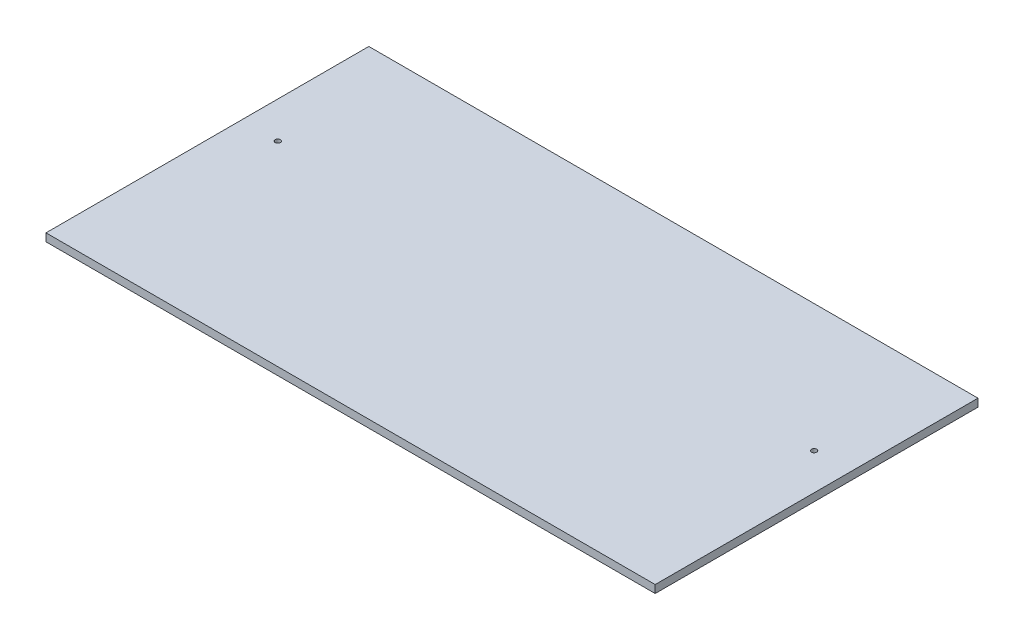
ISO-10303-21;
HEADER;
FILE_DESCRIPTION(('STEP AP214'),'2;1');
FILE_NAME('part.step','',(''),(''),'','','');
FILE_SCHEMA(('AUTOMOTIVE_DESIGN { 1 0 10303 214 1 1 1 1 }'));
ENDSEC;
DATA;
#1=APPLICATION_CONTEXT('core data for automotive mechanical design processes');
#2=APPLICATION_PROTOCOL_DEFINITION('international standard','automotive_design',2000,#1);
#3=PRODUCT_CONTEXT('',#1,'mechanical');
#4=PRODUCT('Part','Part','',(#3));
#5=PRODUCT_RELATED_PRODUCT_CATEGORY('part','',(#4));
#6=PRODUCT_DEFINITION_FORMATION('','',#4);
#7=PRODUCT_DEFINITION_CONTEXT('part definition',#1,'design');
#8=PRODUCT_DEFINITION('design','',#6,#7);
#9=PRODUCT_DEFINITION_SHAPE('','',#8);
#10=(LENGTH_UNIT() NAMED_UNIT(*) SI_UNIT(.MILLI.,.METRE.));
#11=(NAMED_UNIT(*) PLANE_ANGLE_UNIT() SI_UNIT($,.RADIAN.));
#12=(NAMED_UNIT(*) SI_UNIT($,.STERADIAN.) SOLID_ANGLE_UNIT());
#13=UNCERTAINTY_MEASURE_WITH_UNIT(LENGTH_MEASURE(1.E-05),#10,'distance_accuracy_value','');
#14=(GEOMETRIC_REPRESENTATION_CONTEXT(3) GLOBAL_UNCERTAINTY_ASSIGNED_CONTEXT((#13)) GLOBAL_UNIT_ASSIGNED_CONTEXT((#10,
#11,#12)) REPRESENTATION_CONTEXT('',''));
#15=CARTESIAN_POINT('',(0.,0.,0.));
#16=DIRECTION('',(0.,0.,1.));
#17=DIRECTION('',(1.,0.,0.));
#18=AXIS2_PLACEMENT_3D('',#15,#16,#17);
#19=CARTESIAN_POINT('',(371.475,9.525,196.85));
#20=DIRECTION('',(-1.,0.,0.));
#21=DIRECTION('',(0.,0.,1.));
#22=AXIS2_PLACEMENT_3D('',#19,#20,#21);
#23=PLANE('',#22);
#24=DIRECTION('',(0.,0.,-1.));
#25=VECTOR('',#24,1.);
#26=CARTESIAN_POINT('',(371.475,0.,196.85));
#27=LINE('',#26,#25);
#28=CARTESIAN_POINT('',(371.475,0.,196.85));
#29=VERTEX_POINT('',#28);
#30=CARTESIAN_POINT('',(371.475,0.,-196.85));
#31=VERTEX_POINT('',#30);
#32=EDGE_CURVE('E101',#29,#31,#27,.T.);
#33=ORIENTED_EDGE('',*,*,#32,.T.);
#34=DIRECTION('',(0.,-1.,0.));
#35=VECTOR('',#34,1.);
#36=CARTESIAN_POINT('',(371.475,9.525,-196.85));
#37=LINE('',#36,#35);
#38=CARTESIAN_POINT('',(371.475,9.525,-196.85));
#39=VERTEX_POINT('',#38);
#40=EDGE_CURVE('E11',#39,#31,#37,.T.);
#41=ORIENTED_EDGE('',*,*,#40,.F.);
#42=DIRECTION('',(0.,0.,-1.));
#43=VECTOR('',#42,1.);
#44=CARTESIAN_POINT('',(371.475,9.525,196.85));
#45=LINE('',#44,#43);
#46=CARTESIAN_POINT('',(371.475,9.525,196.85));
#47=VERTEX_POINT('',#46);
#48=EDGE_CURVE('E89',#47,#39,#45,.T.);
#49=ORIENTED_EDGE('',*,*,#48,.F.);
#50=DIRECTION('',(0.,-1.,0.));
#51=VECTOR('',#50,1.);
#52=CARTESIAN_POINT('',(371.475,9.525,196.85));
#53=LINE('',#52,#51);
#54=EDGE_CURVE('E97',#47,#29,#53,.T.);
#55=ORIENTED_EDGE('',*,*,#54,.T.);
#56=EDGE_LOOP('',(#33,#41,#49,#55));
#57=FACE_BOUND('',#56,.T.);
#58=ADVANCED_FACE('F38',(#57),#23,.F.);
#59=CARTESIAN_POINT('',(-371.475,9.525,-196.85));
#60=DIRECTION('',(0.,0.,1.));
#61=DIRECTION('',(1.,0.,0.));
#62=AXIS2_PLACEMENT_3D('',#59,#60,#61);
#63=PLANE('',#62);
#64=DIRECTION('',(-1.,0.,0.));
#65=VECTOR('',#64,1.);
#66=CARTESIAN_POINT('',(-371.475,0.,-196.85));
#67=LINE('',#66,#65);
#68=CARTESIAN_POINT('',(-371.475,0.,-196.85));
#69=VERTEX_POINT('',#68);
#70=EDGE_CURVE('E93',#31,#69,#67,.T.);
#71=ORIENTED_EDGE('',*,*,#70,.T.);
#72=DIRECTION('',(0.,-1.,0.));
#73=VECTOR('',#72,1.);
#74=CARTESIAN_POINT('',(-371.475,9.525,-196.85));
#75=LINE('',#74,#73);
#76=CARTESIAN_POINT('',(-371.475,9.525,-196.85));
#77=VERTEX_POINT('',#76);
#78=EDGE_CURVE('E46',#77,#69,#75,.T.);
#79=ORIENTED_EDGE('',*,*,#78,.F.);
#80=DIRECTION('',(-1.,0.,0.));
#81=VECTOR('',#80,1.);
#82=CARTESIAN_POINT('',(-371.475,9.525,-196.85));
#83=LINE('',#82,#81);
#84=EDGE_CURVE('E84',#39,#77,#83,.T.);
#85=ORIENTED_EDGE('',*,*,#84,.F.);
#86=ORIENTED_EDGE('',*,*,#40,.T.);
#87=EDGE_LOOP('',(#71,#79,#85,#86));
#88=FACE_BOUND('',#87,.T.);
#89=ADVANCED_FACE('F92',(#88),#63,.F.);
#90=CARTESIAN_POINT('',(-371.475,9.525,196.85));
#91=DIRECTION('',(1.,0.,0.));
#92=DIRECTION('',(0.,0.,-1.));
#93=AXIS2_PLACEMENT_3D('',#90,#91,#92);
#94=PLANE('',#93);
#95=DIRECTION('',(0.,0.,1.));
#96=VECTOR('',#95,1.);
#97=CARTESIAN_POINT('',(-371.475,0.,196.85));
#98=LINE('',#97,#96);
#99=CARTESIAN_POINT('',(-371.475,0.,196.85));
#100=VERTEX_POINT('',#99);
#101=EDGE_CURVE('E71',#69,#100,#98,.T.);
#102=ORIENTED_EDGE('',*,*,#101,.T.);
#103=DIRECTION('',(0.,-1.,0.));
#104=VECTOR('',#103,1.);
#105=CARTESIAN_POINT('',(-371.475,9.525,196.85));
#106=LINE('',#105,#104);
#107=CARTESIAN_POINT('',(-371.475,9.525,196.85));
#108=VERTEX_POINT('',#107);
#109=EDGE_CURVE('E94',#108,#100,#106,.T.);
#110=ORIENTED_EDGE('',*,*,#109,.F.);
#111=DIRECTION('',(0.,0.,1.));
#112=VECTOR('',#111,1.);
#113=CARTESIAN_POINT('',(-371.475,9.525,196.85));
#114=LINE('',#113,#112);
#115=EDGE_CURVE('E87',#77,#108,#114,.T.);
#116=ORIENTED_EDGE('',*,*,#115,.F.);
#117=ORIENTED_EDGE('',*,*,#78,.T.);
#118=EDGE_LOOP('',(#102,#110,#116,#117));
#119=FACE_BOUND('',#118,.T.);
#120=ADVANCED_FACE('F95',(#119),#94,.F.);
#121=CARTESIAN_POINT('',(-371.475,9.525,196.85));
#122=DIRECTION('',(0.,0.,-1.));
#123=DIRECTION('',(-1.,0.,0.));
#124=AXIS2_PLACEMENT_3D('',#121,#122,#123);
#125=PLANE('',#124);
#126=DIRECTION('',(1.,0.,0.));
#127=VECTOR('',#126,1.);
#128=CARTESIAN_POINT('',(-371.475,0.,196.85));
#129=LINE('',#128,#127);
#130=EDGE_CURVE('E77',#100,#29,#129,.T.);
#131=ORIENTED_EDGE('',*,*,#130,.T.);
#132=ORIENTED_EDGE('',*,*,#54,.F.);
#133=DIRECTION('',(1.,0.,0.));
#134=VECTOR('',#133,1.);
#135=CARTESIAN_POINT('',(-371.475,9.525,196.85));
#136=LINE('',#135,#134);
#137=EDGE_CURVE('E54',#108,#47,#136,.T.);
#138=ORIENTED_EDGE('',*,*,#137,.F.);
#139=ORIENTED_EDGE('',*,*,#109,.T.);
#140=EDGE_LOOP('',(#131,#132,#138,#139));
#141=FACE_BOUND('',#140,.T.);
#142=ADVANCED_FACE('F109',(#141),#125,.F.);
#143=CARTESIAN_POINT('',(0.,9.525,0.));
#144=DIRECTION('',(0.,-1.,0.));
#145=DIRECTION('',(0.,0.,-1.));
#146=AXIS2_PLACEMENT_3D('',#143,#144,#145);
#147=PLANE('',#146);
#148=CARTESIAN_POINT('',(-327.025,9.525,-41.402));
#149=DIRECTION('',(0.,1.,0.));
#150=DIRECTION('',(0.,0.,1.));
#151=AXIS2_PLACEMENT_3D('',#148,#149,#150);
#152=CIRCLE('',#151,3.17499999999997);
#153=CARTESIAN_POINT('',(-327.025,9.525,-38.227));
#154=VERTEX_POINT('',#153);
#155=EDGE_CURVE('E121',#154,#154,#152,.T.);
#156=ORIENTED_EDGE('',*,*,#155,.F.);
#157=EDGE_LOOP('',(#156));
#158=FACE_BOUND('',#157,.T.);
#159=CARTESIAN_POINT('',(327.025,9.525,-41.402));
#160=DIRECTION('',(0.,1.,0.));
#161=DIRECTION('',(0.,0.,1.));
#162=AXIS2_PLACEMENT_3D('',#159,#160,#161);
#163=CIRCLE('',#162,3.17499999999997);
#164=CARTESIAN_POINT('',(327.025,9.525,-38.227));
#165=VERTEX_POINT('',#164);
#166=EDGE_CURVE('E115',#165,#165,#163,.T.);
#167=ORIENTED_EDGE('',*,*,#166,.F.);
#168=EDGE_LOOP('',(#167));
#169=FACE_BOUND('',#168,.T.);
#170=ORIENTED_EDGE('',*,*,#48,.T.);
#171=ORIENTED_EDGE('',*,*,#84,.T.);
#172=ORIENTED_EDGE('',*,*,#115,.T.);
#173=ORIENTED_EDGE('',*,*,#137,.T.);
#174=EDGE_LOOP('',(#170,#171,#172,#173));
#175=FACE_BOUND('',#174,.T.);
#176=ADVANCED_FACE('F85',(#158,#169,#175),#147,.F.);
#177=CARTESIAN_POINT('',(0.,0.,0.));
#178=DIRECTION('',(0.,-1.,0.));
#179=DIRECTION('',(0.,0.,-1.));
#180=AXIS2_PLACEMENT_3D('',#177,#178,#179);
#181=PLANE('',#180);
#182=CARTESIAN_POINT('',(-327.025,0.,-41.402));
#183=DIRECTION('',(0.,1.,0.));
#184=DIRECTION('',(0.,0.,1.));
#185=AXIS2_PLACEMENT_3D('',#182,#183,#184);
#186=CIRCLE('',#185,3.17499999999997);
#187=CARTESIAN_POINT('',(-327.025,0.,-38.227));
#188=VERTEX_POINT('',#187);
#189=EDGE_CURVE('E104',#188,#188,#186,.T.);
#190=ORIENTED_EDGE('',*,*,#189,.T.);
#191=EDGE_LOOP('',(#190));
#192=FACE_BOUND('',#191,.T.);
#193=CARTESIAN_POINT('',(327.025,0.,-41.402));
#194=DIRECTION('',(0.,1.,0.));
#195=DIRECTION('',(0.,0.,1.));
#196=AXIS2_PLACEMENT_3D('',#193,#194,#195);
#197=CIRCLE('',#196,3.17499999999997);
#198=CARTESIAN_POINT('',(327.025,0.,-38.227));
#199=VERTEX_POINT('',#198);
#200=EDGE_CURVE('E118',#199,#199,#197,.T.);
#201=ORIENTED_EDGE('',*,*,#200,.T.);
#202=EDGE_LOOP('',(#201));
#203=FACE_BOUND('',#202,.T.);
#204=ORIENTED_EDGE('',*,*,#32,.F.);
#205=ORIENTED_EDGE('',*,*,#130,.F.);
#206=ORIENTED_EDGE('',*,*,#101,.F.);
#207=ORIENTED_EDGE('',*,*,#70,.F.);
#208=EDGE_LOOP('',(#204,#205,#206,#207));
#209=FACE_BOUND('',#208,.T.);
#210=ADVANCED_FACE('F112',(#192,#203,#209),#181,.T.);
#211=CARTESIAN_POINT('',(327.025,0.,-41.402));
#212=DIRECTION('',(0.,1.,0.));
#213=DIRECTION('',(0.,0.,1.));
#214=AXIS2_PLACEMENT_3D('',#211,#212,#213);
#215=CYLINDRICAL_SURFACE('',#214,3.17499999999997);
#216=CARTESIAN_POINT('',(327.025,0.,-38.227));
#217=CARTESIAN_POINT('',(327.025,0.0992187499999999,-38.227));
#218=CARTESIAN_POINT('',(327.025,0.1984375,-38.227));
#219=CARTESIAN_POINT('',(327.025,0.396875,-38.227));
#220=CARTESIAN_POINT('',(327.025,0.49609375,-38.227));
#221=CARTESIAN_POINT('',(327.025,0.69453125,-38.227));
#222=CARTESIAN_POINT('',(327.025,0.79375,-38.227));
#223=CARTESIAN_POINT('',(327.025,0.9921875,-38.227));
#224=CARTESIAN_POINT('',(327.025,1.09140625,-38.227));
#225=CARTESIAN_POINT('',(327.025,1.28984375,-38.227));
#226=CARTESIAN_POINT('',(327.025,1.3890625,-38.227));
#227=CARTESIAN_POINT('',(327.025,1.5875,-38.227));
#228=CARTESIAN_POINT('',(327.025,1.68671875,-38.227));
#229=CARTESIAN_POINT('',(327.025,1.88515625,-38.227));
#230=CARTESIAN_POINT('',(327.025,1.984375,-38.227));
#231=CARTESIAN_POINT('',(327.025,2.1828125,-38.227));
#232=CARTESIAN_POINT('',(327.025,2.28203125,-38.227));
#233=CARTESIAN_POINT('',(327.025,2.48046875,-38.227));
#234=CARTESIAN_POINT('',(327.025,2.5796875,-38.227));
#235=CARTESIAN_POINT('',(327.025,2.778125,-38.227));
#236=CARTESIAN_POINT('',(327.025,2.87734375,-38.227));
#237=CARTESIAN_POINT('',(327.025,3.07578125,-38.227));
#238=CARTESIAN_POINT('',(327.025,3.175,-38.227));
#239=CARTESIAN_POINT('',(327.025,3.3734375,-38.227));
#240=CARTESIAN_POINT('',(327.025,3.47265625,-38.227));
#241=CARTESIAN_POINT('',(327.025,3.67109375,-38.227));
#242=CARTESIAN_POINT('',(327.025,3.7703125,-38.227));
#243=CARTESIAN_POINT('',(327.025,3.96875,-38.227));
#244=CARTESIAN_POINT('',(327.025,4.06796875,-38.227));
#245=CARTESIAN_POINT('',(327.025,4.26640625,-38.227));
#246=CARTESIAN_POINT('',(327.025,4.365625,-38.227));
#247=CARTESIAN_POINT('',(327.025,4.5640625,-38.227));
#248=CARTESIAN_POINT('',(327.025,4.66328125,-38.227));
#249=CARTESIAN_POINT('',(327.025,4.86171875,-38.227));
#250=CARTESIAN_POINT('',(327.025,4.9609375,-38.227));
#251=CARTESIAN_POINT('',(327.025,5.159375,-38.227));
#252=CARTESIAN_POINT('',(327.025,5.25859375,-38.227));
#253=CARTESIAN_POINT('',(327.025,5.45703125,-38.227));
#254=CARTESIAN_POINT('',(327.025,5.55625,-38.227));
#255=CARTESIAN_POINT('',(327.025,5.7546875,-38.227));
#256=CARTESIAN_POINT('',(327.025,5.85390625,-38.227));
#257=CARTESIAN_POINT('',(327.025,6.05234375,-38.227));
#258=CARTESIAN_POINT('',(327.025,6.1515625,-38.227));
#259=CARTESIAN_POINT('',(327.025,6.35,-38.227));
#260=CARTESIAN_POINT('',(327.025,6.44921875,-38.227));
#261=CARTESIAN_POINT('',(327.025,6.64765625,-38.227));
#262=CARTESIAN_POINT('',(327.025,6.746875,-38.227));
#263=CARTESIAN_POINT('',(327.025,6.9453125,-38.227));
#264=CARTESIAN_POINT('',(327.025,7.04453125,-38.227));
#265=CARTESIAN_POINT('',(327.025,7.24296875,-38.227));
#266=CARTESIAN_POINT('',(327.025,7.3421875,-38.227));
#267=CARTESIAN_POINT('',(327.025,7.540625,-38.227));
#268=CARTESIAN_POINT('',(327.025,7.63984375,-38.227));
#269=CARTESIAN_POINT('',(327.025,7.83828125,-38.227));
#270=CARTESIAN_POINT('',(327.025,7.9375,-38.227));
#271=CARTESIAN_POINT('',(327.025,8.1359375,-38.227));
#272=CARTESIAN_POINT('',(327.025,8.23515625,-38.227));
#273=CARTESIAN_POINT('',(327.025,8.43359375,-38.227));
#274=CARTESIAN_POINT('',(327.025,8.5328125,-38.227));
#275=CARTESIAN_POINT('',(327.025,8.73125,-38.227));
#276=CARTESIAN_POINT('',(327.025,8.83046875,-38.227));
#277=CARTESIAN_POINT('',(327.025,9.02890625,-38.227));
#278=CARTESIAN_POINT('',(327.025,9.128125,-38.227));
#279=CARTESIAN_POINT('',(327.025,9.3265625,-38.227));
#280=CARTESIAN_POINT('',(327.025,9.42578125,-38.227));
#281=CARTESIAN_POINT('',(327.025,9.525,-38.227));
#282=B_SPLINE_CURVE_WITH_KNOTS('',3,(#216,#217,#218,#219,#220,#221,#222,#223,#224,#225,#226,
#227,#228,#229,#230,#231,#232,#233,#234,#235,#236,#237,#238,#239,#240,#241,#242,#243,#244,#245,
#246,#247,#248,#249,#250,#251,#252,#253,#254,#255,#256,#257,#258,#259,#260,#261,#262,#263,#264,
#265,#266,#267,#268,#269,#270,#271,#272,#273,#274,#275,#276,#277,#278,#279,#280,#281),
.UNSPECIFIED.,.F.,.F.,(4,2,2,2,2,2,2,2,2,2,2,2,2,2,2,2,2,2,2,2,2,2,2,2,2,2,2,2,2,2,2,2,4),(0.,
0.29765625,0.5953125,0.89296875,1.190625,1.48828125,1.7859375,2.08359375,2.38125,2.67890625,
2.9765625,3.27421875,3.571875,3.86953125,4.1671875,4.46484375,4.7625,5.06015625,5.3578125,
5.65546875,5.953125,6.25078125,6.5484375,6.84609375,7.14375,7.44140625,7.7390625,8.03671875,
8.334375,8.63203125,8.9296875,9.22734375,9.525),.UNSPECIFIED.);
#283=EDGE_CURVE('BSEAM132',#199,#165,#282,.T.);
#284=ORIENTED_EDGE('',*,*,#200,.F.);
#285=ORIENTED_EDGE('',*,*,#166,.T.);
#286=ORIENTED_EDGE('',*,*,#283,.T.);
#287=ORIENTED_EDGE('',*,*,#283,.F.);
#288=EDGE_LOOP('',(#284,#286,#285,#287));
#289=FACE_BOUND('',#288,.T.);
#290=ADVANCED_FACE('F132',(#289),#215,.F.);
#291=CARTESIAN_POINT('',(-327.025,0.,-41.402));
#292=DIRECTION('',(0.,1.,0.));
#293=DIRECTION('',(0.,0.,1.));
#294=AXIS2_PLACEMENT_3D('',#291,#292,#293);
#295=CYLINDRICAL_SURFACE('',#294,3.17499999999997);
#296=CARTESIAN_POINT('',(-327.025,0.,-38.227));
#297=CARTESIAN_POINT('',(-327.025,0.0992187499999999,-38.227));
#298=CARTESIAN_POINT('',(-327.025,0.1984375,-38.227));
#299=CARTESIAN_POINT('',(-327.025,0.396875,-38.227));
#300=CARTESIAN_POINT('',(-327.025,0.49609375,-38.227));
#301=CARTESIAN_POINT('',(-327.025,0.69453125,-38.227));
#302=CARTESIAN_POINT('',(-327.025,0.79375,-38.227));
#303=CARTESIAN_POINT('',(-327.025,0.9921875,-38.227));
#304=CARTESIAN_POINT('',(-327.025,1.09140625,-38.227));
#305=CARTESIAN_POINT('',(-327.025,1.28984375,-38.227));
#306=CARTESIAN_POINT('',(-327.025,1.3890625,-38.227));
#307=CARTESIAN_POINT('',(-327.025,1.5875,-38.227));
#308=CARTESIAN_POINT('',(-327.025,1.68671875,-38.227));
#309=CARTESIAN_POINT('',(-327.025,1.88515625,-38.227));
#310=CARTESIAN_POINT('',(-327.025,1.984375,-38.227));
#311=CARTESIAN_POINT('',(-327.025,2.1828125,-38.227));
#312=CARTESIAN_POINT('',(-327.025,2.28203125,-38.227));
#313=CARTESIAN_POINT('',(-327.025,2.48046875,-38.227));
#314=CARTESIAN_POINT('',(-327.025,2.5796875,-38.227));
#315=CARTESIAN_POINT('',(-327.025,2.778125,-38.227));
#316=CARTESIAN_POINT('',(-327.025,2.87734375,-38.227));
#317=CARTESIAN_POINT('',(-327.025,3.07578125,-38.227));
#318=CARTESIAN_POINT('',(-327.025,3.175,-38.227));
#319=CARTESIAN_POINT('',(-327.025,3.3734375,-38.227));
#320=CARTESIAN_POINT('',(-327.025,3.47265625,-38.227));
#321=CARTESIAN_POINT('',(-327.025,3.67109375,-38.227));
#322=CARTESIAN_POINT('',(-327.025,3.7703125,-38.227));
#323=CARTESIAN_POINT('',(-327.025,3.96875,-38.227));
#324=CARTESIAN_POINT('',(-327.025,4.06796875,-38.227));
#325=CARTESIAN_POINT('',(-327.025,4.26640625,-38.227));
#326=CARTESIAN_POINT('',(-327.025,4.365625,-38.227));
#327=CARTESIAN_POINT('',(-327.025,4.5640625,-38.227));
#328=CARTESIAN_POINT('',(-327.025,4.66328125,-38.227));
#329=CARTESIAN_POINT('',(-327.025,4.86171875,-38.227));
#330=CARTESIAN_POINT('',(-327.025,4.9609375,-38.227));
#331=CARTESIAN_POINT('',(-327.025,5.159375,-38.227));
#332=CARTESIAN_POINT('',(-327.025,5.25859375,-38.227));
#333=CARTESIAN_POINT('',(-327.025,5.45703125,-38.227));
#334=CARTESIAN_POINT('',(-327.025,5.55625,-38.227));
#335=CARTESIAN_POINT('',(-327.025,5.7546875,-38.227));
#336=CARTESIAN_POINT('',(-327.025,5.85390625,-38.227));
#337=CARTESIAN_POINT('',(-327.025,6.05234375,-38.227));
#338=CARTESIAN_POINT('',(-327.025,6.1515625,-38.227));
#339=CARTESIAN_POINT('',(-327.025,6.35,-38.227));
#340=CARTESIAN_POINT('',(-327.025,6.44921875,-38.227));
#341=CARTESIAN_POINT('',(-327.025,6.64765625,-38.227));
#342=CARTESIAN_POINT('',(-327.025,6.746875,-38.227));
#343=CARTESIAN_POINT('',(-327.025,6.9453125,-38.227));
#344=CARTESIAN_POINT('',(-327.025,7.04453125,-38.227));
#345=CARTESIAN_POINT('',(-327.025,7.24296875,-38.227));
#346=CARTESIAN_POINT('',(-327.025,7.3421875,-38.227));
#347=CARTESIAN_POINT('',(-327.025,7.540625,-38.227));
#348=CARTESIAN_POINT('',(-327.025,7.63984375,-38.227));
#349=CARTESIAN_POINT('',(-327.025,7.83828125,-38.227));
#350=CARTESIAN_POINT('',(-327.025,7.9375,-38.227));
#351=CARTESIAN_POINT('',(-327.025,8.1359375,-38.227));
#352=CARTESIAN_POINT('',(-327.025,8.23515625,-38.227));
#353=CARTESIAN_POINT('',(-327.025,8.43359375,-38.227));
#354=CARTESIAN_POINT('',(-327.025,8.5328125,-38.227));
#355=CARTESIAN_POINT('',(-327.025,8.73125,-38.227));
#356=CARTESIAN_POINT('',(-327.025,8.83046875,-38.227));
#357=CARTESIAN_POINT('',(-327.025,9.02890625,-38.227));
#358=CARTESIAN_POINT('',(-327.025,9.128125,-38.227));
#359=CARTESIAN_POINT('',(-327.025,9.3265625,-38.227));
#360=CARTESIAN_POINT('',(-327.025,9.42578125,-38.227));
#361=CARTESIAN_POINT('',(-327.025,9.525,-38.227));
#362=B_SPLINE_CURVE_WITH_KNOTS('',3,(#296,#297,#298,#299,#300,#301,#302,#303,#304,#305,#306,
#307,#308,#309,#310,#311,#312,#313,#314,#315,#316,#317,#318,#319,#320,#321,#322,#323,#324,#325,
#326,#327,#328,#329,#330,#331,#332,#333,#334,#335,#336,#337,#338,#339,#340,#341,#342,#343,#344,
#345,#346,#347,#348,#349,#350,#351,#352,#353,#354,#355,#356,#357,#358,#359,#360,#361),
.UNSPECIFIED.,.F.,.F.,(4,2,2,2,2,2,2,2,2,2,2,2,2,2,2,2,2,2,2,2,2,2,2,2,2,2,2,2,2,2,2,2,4),(0.,
0.29765625,0.5953125,0.89296875,1.190625,1.48828125,1.7859375,2.08359375,2.38125,2.67890625,
2.9765625,3.27421875,3.571875,3.86953125,4.1671875,4.46484375,4.7625,5.06015625,5.3578125,
5.65546875,5.953125,6.25078125,6.5484375,6.84609375,7.14375,7.44140625,7.7390625,8.03671875,
8.334375,8.63203125,8.9296875,9.22734375,9.525),.UNSPECIFIED.);
#363=EDGE_CURVE('BSEAM129',#188,#154,#362,.T.);
#364=ORIENTED_EDGE('',*,*,#189,.F.);
#365=ORIENTED_EDGE('',*,*,#155,.T.);
#366=ORIENTED_EDGE('',*,*,#363,.T.);
#367=ORIENTED_EDGE('',*,*,#363,.F.);
#368=EDGE_LOOP('',(#364,#366,#365,#367));
#369=FACE_BOUND('',#368,.T.);
#370=ADVANCED_FACE('F129',(#369),#295,.F.);
#371=CLOSED_SHELL('',(#58,#89,#120,#142,#176,#210,#290,#370));
#372=MANIFOLD_SOLID_BREP('B2',#371);
#373=ADVANCED_BREP_SHAPE_REPRESENTATION('',(#18,#372),#14);
#374=SHAPE_DEFINITION_REPRESENTATION(#9,#373);
ENDSEC;
END-ISO-10303-21;
